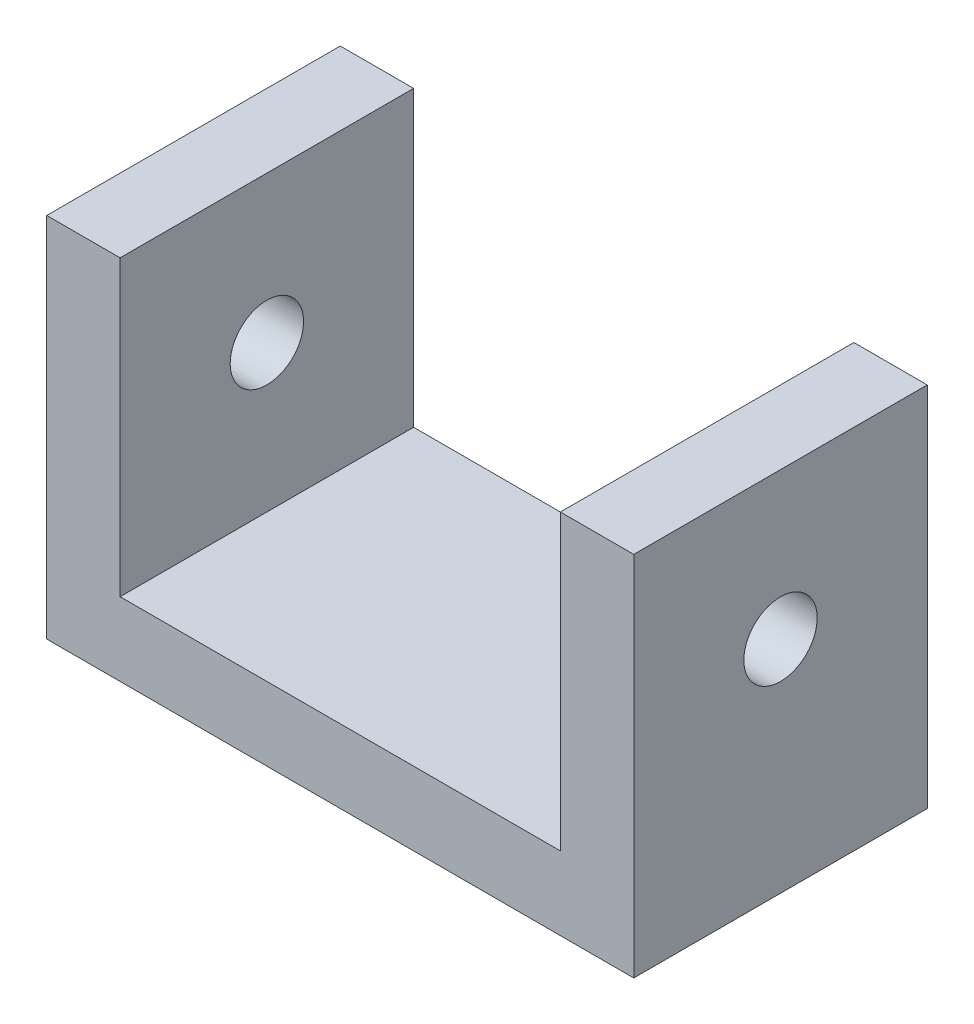
ISO-10303-21;
HEADER;
FILE_DESCRIPTION(('STEP AP214'),'2;1');
FILE_NAME('part.step','',(''),(''),'','','');
FILE_SCHEMA(('AUTOMOTIVE_DESIGN { 1 0 10303 214 1 1 1 1 }'));
ENDSEC;
DATA;
#1=APPLICATION_CONTEXT('core data for automotive mechanical design processes');
#2=APPLICATION_PROTOCOL_DEFINITION('international standard','automotive_design',2000,#1);
#3=PRODUCT_CONTEXT('',#1,'mechanical');
#4=PRODUCT('Part','Part','',(#3));
#5=PRODUCT_RELATED_PRODUCT_CATEGORY('part','',(#4));
#6=PRODUCT_DEFINITION_FORMATION('','',#4);
#7=PRODUCT_DEFINITION_CONTEXT('part definition',#1,'design');
#8=PRODUCT_DEFINITION('design','',#6,#7);
#9=PRODUCT_DEFINITION_SHAPE('','',#8);
#10=(LENGTH_UNIT() NAMED_UNIT(*) SI_UNIT(.MILLI.,.METRE.));
#11=(NAMED_UNIT(*) PLANE_ANGLE_UNIT() SI_UNIT($,.RADIAN.));
#12=(NAMED_UNIT(*) SI_UNIT($,.STERADIAN.) SOLID_ANGLE_UNIT());
#13=UNCERTAINTY_MEASURE_WITH_UNIT(LENGTH_MEASURE(1.E-05),#10,'distance_accuracy_value','');
#14=(GEOMETRIC_REPRESENTATION_CONTEXT(3) GLOBAL_UNCERTAINTY_ASSIGNED_CONTEXT((#13)) GLOBAL_UNIT_ASSIGNED_CONTEXT((#10,
#11,#12)) REPRESENTATION_CONTEXT('',''));
#15=CARTESIAN_POINT('',(0.,0.,0.));
#16=DIRECTION('',(0.,0.,1.));
#17=DIRECTION('',(1.,0.,0.));
#18=AXIS2_PLACEMENT_3D('',#15,#16,#17);
#19=CARTESIAN_POINT('',(-14.6565420853225,9.525,25.4));
#20=DIRECTION('',(1.,0.,0.));
#21=DIRECTION('',(0.,1.,0.));
#22=AXIS2_PLACEMENT_3D('',#19,#20,#21);
#23=PLANE('',#22);
#24=CARTESIAN_POINT('',(-14.6565420853225,12.7,12.7));
#25=DIRECTION('',(-1.,0.,0.));
#26=DIRECTION('',(0.,-1.,0.));
#27=AXIS2_PLACEMENT_3D('',#24,#25,#26);
#28=CIRCLE('',#27,3.175);
#29=CARTESIAN_POINT('',(-14.6565420853225,9.525,12.7));
#30=VERTEX_POINT('',#29);
#31=EDGE_CURVE('E168',#30,#30,#28,.T.);
#32=ORIENTED_EDGE('',*,*,#31,.F.);
#33=EDGE_LOOP('',(#32));
#34=FACE_BOUND('',#33,.T.);
#35=DIRECTION('',(0.,-1.,0.));
#36=VECTOR('',#35,1.);
#37=CARTESIAN_POINT('',(-14.6565420853225,9.525,0.));
#38=LINE('',#37,#36);
#39=CARTESIAN_POINT('',(-14.6565420853225,25.4,0.));
#40=VERTEX_POINT('',#39);
#41=CARTESIAN_POINT('',(-14.6565420853225,-6.35,0.));
#42=VERTEX_POINT('',#41);
#43=EDGE_CURVE('E114',#40,#42,#38,.T.);
#44=ORIENTED_EDGE('',*,*,#43,.T.);
#45=DIRECTION('',(0.,0.,-1.));
#46=VECTOR('',#45,1.);
#47=CARTESIAN_POINT('',(-14.6565420853225,-6.35,25.4));
#48=LINE('',#47,#46);
#49=CARTESIAN_POINT('',(-14.6565420853225,-6.35,25.4));
#50=VERTEX_POINT('',#49);
#51=EDGE_CURVE('E11',#50,#42,#48,.T.);
#52=ORIENTED_EDGE('',*,*,#51,.F.);
#53=DIRECTION('',(0.,-1.,0.));
#54=VECTOR('',#53,1.);
#55=CARTESIAN_POINT('',(-14.6565420853225,9.525,25.4));
#56=LINE('',#55,#54);
#57=CARTESIAN_POINT('',(-14.6565420853225,25.4,25.4));
#58=VERTEX_POINT('',#57);
#59=EDGE_CURVE('E129',#58,#50,#56,.T.);
#60=ORIENTED_EDGE('',*,*,#59,.F.);
#61=DIRECTION('',(0.,0.,-1.));
#62=VECTOR('',#61,1.);
#63=CARTESIAN_POINT('',(-14.6565420853225,25.4,25.4));
#64=LINE('',#63,#62);
#65=EDGE_CURVE('E110',#58,#40,#64,.T.);
#66=ORIENTED_EDGE('',*,*,#65,.T.);
#67=EDGE_LOOP('',(#44,#52,#60,#66));
#68=FACE_BOUND('',#67,.T.);
#69=ADVANCED_FACE('F17',(#34,#68),#23,.F.);
#70=CARTESIAN_POINT('',(10.7434579146775,-6.35,25.4));
#71=DIRECTION('',(0.,1.,0.));
#72=DIRECTION('',(-1.,0.,0.));
#73=AXIS2_PLACEMENT_3D('',#70,#71,#72);
#74=PLANE('',#73);
#75=DIRECTION('',(1.,0.,0.));
#76=VECTOR('',#75,1.);
#77=CARTESIAN_POINT('',(10.7434579146775,-6.35,0.));
#78=LINE('',#77,#76);
#79=CARTESIAN_POINT('',(36.1434579146775,-6.35,0.));
#80=VERTEX_POINT('',#79);
#81=EDGE_CURVE('E117',#42,#80,#78,.T.);
#82=ORIENTED_EDGE('',*,*,#81,.T.);
#83=DIRECTION('',(0.,0.,-1.));
#84=VECTOR('',#83,1.);
#85=CARTESIAN_POINT('',(36.1434579146775,-6.35,25.4));
#86=LINE('',#85,#84);
#87=CARTESIAN_POINT('',(36.1434579146775,-6.35,25.4));
#88=VERTEX_POINT('',#87);
#89=EDGE_CURVE('E26',#88,#80,#86,.T.);
#90=ORIENTED_EDGE('',*,*,#89,.F.);
#91=DIRECTION('',(1.,0.,0.));
#92=VECTOR('',#91,1.);
#93=CARTESIAN_POINT('',(10.7434579146775,-6.35,25.4));
#94=LINE('',#93,#92);
#95=EDGE_CURVE('E77',#50,#88,#94,.T.);
#96=ORIENTED_EDGE('',*,*,#95,.F.);
#97=ORIENTED_EDGE('',*,*,#51,.T.);
#98=EDGE_LOOP('',(#82,#90,#96,#97));
#99=FACE_BOUND('',#98,.T.);
#100=ADVANCED_FACE('F189',(#99),#74,.F.);
#101=CARTESIAN_POINT('',(36.1434579146775,9.525,25.4));
#102=DIRECTION('',(-1.,0.,0.));
#103=DIRECTION('',(0.,0.,1.));
#104=AXIS2_PLACEMENT_3D('',#101,#102,#103);
#105=PLANE('',#104);
#106=CARTESIAN_POINT('',(36.1434579146775,12.7,12.7));
#107=DIRECTION('',(-1.,0.,0.));
#108=DIRECTION('',(0.,0.,1.));
#109=AXIS2_PLACEMENT_3D('',#106,#107,#108);
#110=CIRCLE('',#109,3.175);
#111=CARTESIAN_POINT('',(36.1434579146775,12.7,15.875));
#112=VERTEX_POINT('',#111);
#113=EDGE_CURVE('E118',#112,#112,#110,.T.);
#114=ORIENTED_EDGE('',*,*,#113,.T.);
#115=EDGE_LOOP('',(#114));
#116=FACE_BOUND('',#115,.T.);
#117=DIRECTION('',(0.,1.,0.));
#118=VECTOR('',#117,1.);
#119=CARTESIAN_POINT('',(36.1434579146775,9.525,0.));
#120=LINE('',#119,#118);
#121=CARTESIAN_POINT('',(36.1434579146775,25.4,0.));
#122=VERTEX_POINT('',#121);
#123=EDGE_CURVE('E120',#80,#122,#120,.T.);
#124=ORIENTED_EDGE('',*,*,#123,.T.);
#125=DIRECTION('',(0.,0.,-1.));
#126=VECTOR('',#125,1.);
#127=CARTESIAN_POINT('',(36.1434579146775,25.4,25.4));
#128=LINE('',#127,#126);
#129=CARTESIAN_POINT('',(36.1434579146775,25.4,25.4));
#130=VERTEX_POINT('',#129);
#131=EDGE_CURVE('E136',#130,#122,#128,.T.);
#132=ORIENTED_EDGE('',*,*,#131,.F.);
#133=DIRECTION('',(0.,1.,0.));
#134=VECTOR('',#133,1.);
#135=CARTESIAN_POINT('',(36.1434579146775,9.525,25.4));
#136=LINE('',#135,#134);
#137=EDGE_CURVE('E145',#88,#130,#136,.T.);
#138=ORIENTED_EDGE('',*,*,#137,.F.);
#139=ORIENTED_EDGE('',*,*,#89,.T.);
#140=EDGE_LOOP('',(#124,#132,#138,#139));
#141=FACE_BOUND('',#140,.T.);
#142=ADVANCED_FACE('F143',(#116,#141),#105,.F.);
#143=CARTESIAN_POINT('',(32.9684579146775,25.4,25.4));
#144=DIRECTION('',(0.,-1.,0.));
#145=DIRECTION('',(1.,0.,0.));
#146=AXIS2_PLACEMENT_3D('',#143,#144,#145);
#147=PLANE('',#146);
#148=DIRECTION('',(-1.,0.,0.));
#149=VECTOR('',#148,1.);
#150=CARTESIAN_POINT('',(32.9684579146775,25.4,0.));
#151=LINE('',#150,#149);
#152=CARTESIAN_POINT('',(29.7934579146775,25.4,0.));
#153=VERTEX_POINT('',#152);
#154=EDGE_CURVE('E122',#122,#153,#151,.T.);
#155=ORIENTED_EDGE('',*,*,#154,.T.);
#156=DIRECTION('',(0.,0.,-1.));
#157=VECTOR('',#156,1.);
#158=CARTESIAN_POINT('',(29.7934579146775,25.4,25.4));
#159=LINE('',#158,#157);
#160=CARTESIAN_POINT('',(29.7934579146775,25.4,25.4));
#161=VERTEX_POINT('',#160);
#162=EDGE_CURVE('E133',#161,#153,#159,.T.);
#163=ORIENTED_EDGE('',*,*,#162,.F.);
#164=DIRECTION('',(-1.,0.,0.));
#165=VECTOR('',#164,1.);
#166=CARTESIAN_POINT('',(32.9684579146775,25.4,25.4));
#167=LINE('',#166,#165);
#168=EDGE_CURVE('E157',#130,#161,#167,.T.);
#169=ORIENTED_EDGE('',*,*,#168,.F.);
#170=ORIENTED_EDGE('',*,*,#131,.T.);
#171=EDGE_LOOP('',(#155,#163,#169,#170));
#172=FACE_BOUND('',#171,.T.);
#173=ADVANCED_FACE('F153',(#172),#147,.F.);
#174=CARTESIAN_POINT('',(29.7934579146775,12.7,25.4));
#175=DIRECTION('',(1.,0.,0.));
#176=DIRECTION('',(0.,1.,0.));
#177=AXIS2_PLACEMENT_3D('',#174,#175,#176);
#178=PLANE('',#177);
#179=CARTESIAN_POINT('',(29.7934579146775,12.7,12.7));
#180=DIRECTION('',(1.,0.,0.));
#181=DIRECTION('',(0.,1.,0.));
#182=AXIS2_PLACEMENT_3D('',#179,#180,#181);
#183=CIRCLE('',#182,3.175);
#184=CARTESIAN_POINT('',(29.7934579146775,15.875,12.7));
#185=VERTEX_POINT('',#184);
#186=EDGE_CURVE('E165',#185,#185,#183,.T.);
#187=ORIENTED_EDGE('',*,*,#186,.T.);
#188=EDGE_LOOP('',(#187));
#189=FACE_BOUND('',#188,.T.);
#190=DIRECTION('',(0.,-1.,0.));
#191=VECTOR('',#190,1.);
#192=CARTESIAN_POINT('',(29.7934579146775,12.7,0.));
#193=LINE('',#192,#191);
#194=CARTESIAN_POINT('',(29.7934579146775,0.,0.));
#195=VERTEX_POINT('',#194);
#196=EDGE_CURVE('E124',#153,#195,#193,.T.);
#197=ORIENTED_EDGE('',*,*,#196,.T.);
#198=DIRECTION('',(0.,0.,-1.));
#199=VECTOR('',#198,1.);
#200=CARTESIAN_POINT('',(29.7934579146775,0.,25.4));
#201=LINE('',#200,#199);
#202=CARTESIAN_POINT('',(29.7934579146775,0.,25.4));
#203=VERTEX_POINT('',#202);
#204=EDGE_CURVE('E105',#203,#195,#201,.T.);
#205=ORIENTED_EDGE('',*,*,#204,.F.);
#206=DIRECTION('',(0.,-1.,0.));
#207=VECTOR('',#206,1.);
#208=CARTESIAN_POINT('',(29.7934579146775,12.7,25.4));
#209=LINE('',#208,#207);
#210=EDGE_CURVE('E96',#161,#203,#209,.T.);
#211=ORIENTED_EDGE('',*,*,#210,.F.);
#212=ORIENTED_EDGE('',*,*,#162,.T.);
#213=EDGE_LOOP('',(#197,#205,#211,#212));
#214=FACE_BOUND('',#213,.T.);
#215=ADVANCED_FACE('F156',(#189,#214),#178,.F.);
#216=CARTESIAN_POINT('',(10.7434579146775,0.,25.4));
#217=DIRECTION('',(0.,-1.,0.));
#218=DIRECTION('',(0.,0.,-1.));
#219=AXIS2_PLACEMENT_3D('',#216,#217,#218);
#220=PLANE('',#219);
#221=DIRECTION('',(-1.,0.,0.));
#222=VECTOR('',#221,1.);
#223=CARTESIAN_POINT('',(10.7434579146775,0.,0.));
#224=LINE('',#223,#222);
#225=CARTESIAN_POINT('',(-8.30654208532248,0.,0.));
#226=VERTEX_POINT('',#225);
#227=EDGE_CURVE('E104',#195,#226,#224,.T.);
#228=ORIENTED_EDGE('',*,*,#227,.T.);
#229=DIRECTION('',(0.,0.,-1.));
#230=VECTOR('',#229,1.);
#231=CARTESIAN_POINT('',(-8.30654208532248,0.,25.4));
#232=LINE('',#231,#230);
#233=CARTESIAN_POINT('',(-8.30654208532248,0.,25.4));
#234=VERTEX_POINT('',#233);
#235=EDGE_CURVE('E101',#234,#226,#232,.T.);
#236=ORIENTED_EDGE('',*,*,#235,.F.);
#237=DIRECTION('',(-1.,0.,0.));
#238=VECTOR('',#237,1.);
#239=CARTESIAN_POINT('',(10.7434579146775,0.,25.4));
#240=LINE('',#239,#238);
#241=EDGE_CURVE('E90',#203,#234,#240,.T.);
#242=ORIENTED_EDGE('',*,*,#241,.F.);
#243=ORIENTED_EDGE('',*,*,#204,.T.);
#244=EDGE_LOOP('',(#228,#236,#242,#243));
#245=FACE_BOUND('',#244,.T.);
#246=ADVANCED_FACE('F102',(#245),#220,.F.);
#247=CARTESIAN_POINT('',(-8.30654208532248,12.7,25.4));
#248=DIRECTION('',(-1.,0.,0.));
#249=DIRECTION('',(0.,0.,1.));
#250=AXIS2_PLACEMENT_3D('',#247,#248,#249);
#251=PLANE('',#250);
#252=CARTESIAN_POINT('',(-8.30654208532248,12.7,12.7));
#253=DIRECTION('',(-1.,0.,0.));
#254=DIRECTION('',(0.,0.,1.));
#255=AXIS2_PLACEMENT_3D('',#252,#253,#254);
#256=CIRCLE('',#255,3.175);
#257=CARTESIAN_POINT('',(-8.30654208532248,12.7,15.875));
#258=VERTEX_POINT('',#257);
#259=EDGE_CURVE('E20',#258,#258,#256,.T.);
#260=ORIENTED_EDGE('',*,*,#259,.T.);
#261=EDGE_LOOP('',(#260));
#262=FACE_BOUND('',#261,.T.);
#263=DIRECTION('',(0.,1.,0.));
#264=VECTOR('',#263,1.);
#265=CARTESIAN_POINT('',(-8.30654208532248,12.7,0.));
#266=LINE('',#265,#264);
#267=CARTESIAN_POINT('',(-8.30654208532248,25.4,0.));
#268=VERTEX_POINT('',#267);
#269=EDGE_CURVE('E63',#226,#268,#266,.T.);
#270=ORIENTED_EDGE('',*,*,#269,.T.);
#271=DIRECTION('',(0.,0.,-1.));
#272=VECTOR('',#271,1.);
#273=CARTESIAN_POINT('',(-8.30654208532248,25.4,25.4));
#274=LINE('',#273,#272);
#275=CARTESIAN_POINT('',(-8.30654208532248,25.4,25.4));
#276=VERTEX_POINT('',#275);
#277=EDGE_CURVE('E106',#276,#268,#274,.T.);
#278=ORIENTED_EDGE('',*,*,#277,.F.);
#279=DIRECTION('',(0.,1.,0.));
#280=VECTOR('',#279,1.);
#281=CARTESIAN_POINT('',(-8.30654208532248,12.7,25.4));
#282=LINE('',#281,#280);
#283=EDGE_CURVE('E94',#234,#276,#282,.T.);
#284=ORIENTED_EDGE('',*,*,#283,.F.);
#285=ORIENTED_EDGE('',*,*,#235,.T.);
#286=EDGE_LOOP('',(#270,#278,#284,#285));
#287=FACE_BOUND('',#286,.T.);
#288=ADVANCED_FACE('F108',(#262,#287),#251,.F.);
#289=CARTESIAN_POINT('',(-11.4815420853225,25.4,25.4));
#290=DIRECTION('',(0.,-1.,0.));
#291=DIRECTION('',(0.,0.,-1.));
#292=AXIS2_PLACEMENT_3D('',#289,#290,#291);
#293=PLANE('',#292);
#294=DIRECTION('',(-1.,0.,0.));
#295=VECTOR('',#294,1.);
#296=CARTESIAN_POINT('',(-11.4815420853225,25.4,0.));
#297=LINE('',#296,#295);
#298=EDGE_CURVE('E69',#268,#40,#297,.T.);
#299=ORIENTED_EDGE('',*,*,#298,.T.);
#300=ORIENTED_EDGE('',*,*,#65,.F.);
#301=DIRECTION('',(-1.,0.,0.));
#302=VECTOR('',#301,1.);
#303=CARTESIAN_POINT('',(-11.4815420853225,25.4,25.4));
#304=LINE('',#303,#302);
#305=EDGE_CURVE('E34',#276,#58,#304,.T.);
#306=ORIENTED_EDGE('',*,*,#305,.F.);
#307=ORIENTED_EDGE('',*,*,#277,.T.);
#308=EDGE_LOOP('',(#299,#300,#306,#307));
#309=FACE_BOUND('',#308,.T.);
#310=ADVANCED_FACE('F197',(#309),#293,.F.);
#311=CARTESIAN_POINT('',(10.7434579146775,9.525,25.4));
#312=DIRECTION('',(0.,0.,1.));
#313=DIRECTION('',(1.,0.,0.));
#314=AXIS2_PLACEMENT_3D('',#311,#312,#313);
#315=PLANE('',#314);
#316=ORIENTED_EDGE('',*,*,#59,.T.);
#317=ORIENTED_EDGE('',*,*,#95,.T.);
#318=ORIENTED_EDGE('',*,*,#137,.T.);
#319=ORIENTED_EDGE('',*,*,#168,.T.);
#320=ORIENTED_EDGE('',*,*,#210,.T.);
#321=ORIENTED_EDGE('',*,*,#241,.T.);
#322=ORIENTED_EDGE('',*,*,#283,.T.);
#323=ORIENTED_EDGE('',*,*,#305,.T.);
#324=EDGE_LOOP('',(#316,#317,#318,#319,#320,#321,#322,#323));
#325=FACE_BOUND('',#324,.T.);
#326=ADVANCED_FACE('F92',(#325),#315,.T.);
#327=CARTESIAN_POINT('',(10.7434579146775,9.525,0.));
#328=DIRECTION('',(0.,0.,1.));
#329=DIRECTION('',(1.,0.,0.));
#330=AXIS2_PLACEMENT_3D('',#327,#328,#329);
#331=PLANE('',#330);
#332=ORIENTED_EDGE('',*,*,#43,.F.);
#333=ORIENTED_EDGE('',*,*,#298,.F.);
#334=ORIENTED_EDGE('',*,*,#269,.F.);
#335=ORIENTED_EDGE('',*,*,#227,.F.);
#336=ORIENTED_EDGE('',*,*,#196,.F.);
#337=ORIENTED_EDGE('',*,*,#154,.F.);
#338=ORIENTED_EDGE('',*,*,#123,.F.);
#339=ORIENTED_EDGE('',*,*,#81,.F.);
#340=EDGE_LOOP('',(#332,#333,#334,#335,#336,#337,#338,#339));
#341=FACE_BOUND('',#340,.T.);
#342=ADVANCED_FACE('F149',(#341),#331,.F.);
#343=CARTESIAN_POINT('',(50.421595278521,12.7,12.7));
#344=DIRECTION('',(-1.,0.,0.));
#345=DIRECTION('',(0.,-1.,0.));
#346=AXIS2_PLACEMENT_3D('',#343,#344,#345);
#347=CYLINDRICAL_SURFACE('',#346,3.175);
#348=ORIENTED_EDGE('',*,*,#31,.T.);
#349=EDGE_LOOP('',(#348));
#350=FACE_BOUND('',#349,.T.);
#351=ORIENTED_EDGE('',*,*,#259,.F.);
#352=EDGE_LOOP('',(#351));
#353=FACE_BOUND('',#352,.T.);
#354=ADVANCED_FACE('F176',(#350,#353),#347,.F.);
#355=ORIENTED_EDGE('',*,*,#186,.F.);
#356=EDGE_LOOP('',(#355));
#357=FACE_BOUND('',#356,.T.);
#358=ORIENTED_EDGE('',*,*,#113,.F.);
#359=EDGE_LOOP('',(#358));
#360=FACE_BOUND('',#359,.T.);
#361=ADVANCED_FACE('F178',(#357,#360),#347,.F.);
#362=CLOSED_SHELL('',(#69,#100,#142,#173,#215,#246,#288,#310,#326,#342,#354,#361));
#363=MANIFOLD_SOLID_BREP('B1',#362);
#364=ADVANCED_BREP_SHAPE_REPRESENTATION('',(#18,#363),#14);
#365=SHAPE_DEFINITION_REPRESENTATION(#9,#364);
ENDSEC;
END-ISO-10303-21;
